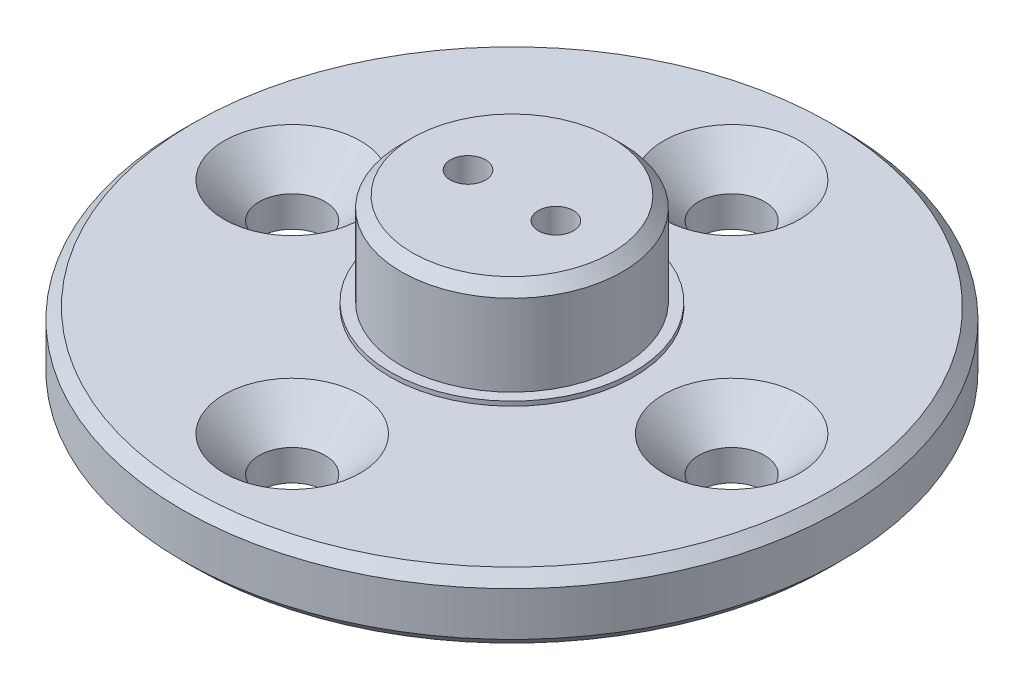
ISO-10303-21;
HEADER;
FILE_DESCRIPTION(('STEP AP214'),'2;1');
FILE_NAME('part.step','',(''),(''),'','','');
FILE_SCHEMA(('AUTOMOTIVE_DESIGN { 1 0 10303 214 1 1 1 1 }'));
ENDSEC;
DATA;
#1=APPLICATION_CONTEXT('core data for automotive mechanical design processes');
#2=APPLICATION_PROTOCOL_DEFINITION('international standard','automotive_design',2000,#1);
#3=PRODUCT_CONTEXT('',#1,'mechanical');
#4=PRODUCT('Part','Part','',(#3));
#5=PRODUCT_RELATED_PRODUCT_CATEGORY('part','',(#4));
#6=PRODUCT_DEFINITION_FORMATION('','',#4);
#7=PRODUCT_DEFINITION_CONTEXT('part definition',#1,'design');
#8=PRODUCT_DEFINITION('design','',#6,#7);
#9=PRODUCT_DEFINITION_SHAPE('','',#8);
#10=(LENGTH_UNIT() NAMED_UNIT(*) SI_UNIT(.MILLI.,.METRE.));
#11=(NAMED_UNIT(*) PLANE_ANGLE_UNIT() SI_UNIT($,.RADIAN.));
#12=(NAMED_UNIT(*) SI_UNIT($,.STERADIAN.) SOLID_ANGLE_UNIT());
#13=UNCERTAINTY_MEASURE_WITH_UNIT(LENGTH_MEASURE(1.E-05),#10,'distance_accuracy_value','');
#14=(GEOMETRIC_REPRESENTATION_CONTEXT(3) GLOBAL_UNCERTAINTY_ASSIGNED_CONTEXT((#13)) GLOBAL_UNIT_ASSIGNED_CONTEXT((#10,
#11,#12)) REPRESENTATION_CONTEXT('',''));
#15=CARTESIAN_POINT('',(0.,0.,0.));
#16=DIRECTION('',(0.,0.,1.));
#17=DIRECTION('',(1.,0.,0.));
#18=AXIS2_PLACEMENT_3D('',#15,#16,#17);
#19=CARTESIAN_POINT('',(0.,3.,0.));
#20=DIRECTION('',(0.,1.,0.));
#21=DIRECTION('',(0.,0.,1.));
#22=AXIS2_PLACEMENT_3D('',#19,#20,#21);
#23=PLANE('',#22);
#24=CARTESIAN_POINT('',(9.99999999999972,3.,0.));
#25=DIRECTION('',(0.,1.,0.));
#26=DIRECTION('',(0.,0.,1.));
#27=AXIS2_PLACEMENT_3D('',#24,#25,#26);
#28=CIRCLE('',#27,3.1);
#29=CARTESIAN_POINT('',(9.99999999999972,3.,3.10000000000004));
#30=VERTEX_POINT('',#29);
#31=EDGE_CURVE('E51',#30,#30,#28,.F.);
#32=ORIENTED_EDGE('',*,*,#31,.T.);
#33=EDGE_LOOP('',(#32));
#34=FACE_BOUND('',#33,.T.);
#35=CARTESIAN_POINT('',(2.8275992658422E-13,3.,10.));
#36=DIRECTION('',(0.,1.,0.));
#37=DIRECTION('',(0.,0.,1.));
#38=AXIS2_PLACEMENT_3D('',#35,#36,#37);
#39=CIRCLE('',#38,3.10000000000062);
#40=CARTESIAN_POINT('',(2.8275992658422E-13,3.,13.1000000000006));
#41=VERTEX_POINT('',#40);
#42=EDGE_CURVE('E56',#41,#41,#39,.F.);
#43=ORIENTED_EDGE('',*,*,#42,.T.);
#44=EDGE_LOOP('',(#43));
#45=FACE_BOUND('',#44,.T.);
#46=CARTESIAN_POINT('',(-10.0000000000003,3.,-1.04083408558608E-13));
#47=DIRECTION('',(0.,1.,0.));
#48=DIRECTION('',(0.,0.,1.));
#49=AXIS2_PLACEMENT_3D('',#46,#47,#48);
#50=CIRCLE('',#49,3.1);
#51=CARTESIAN_POINT('',(-10.0000000000003,3.,3.0999999999999));
#52=VERTEX_POINT('',#51);
#53=EDGE_CURVE('E59',#52,#52,#50,.F.);
#54=ORIENTED_EDGE('',*,*,#53,.T.);
#55=EDGE_LOOP('',(#54));
#56=FACE_BOUND('',#55,.T.);
#57=CARTESIAN_POINT('',(-2.81025203108243E-13,3.,-10.));
#58=DIRECTION('',(0.,1.,0.));
#59=DIRECTION('',(0.,0.,1.));
#60=AXIS2_PLACEMENT_3D('',#57,#58,#59);
#61=CIRCLE('',#60,3.1);
#62=CARTESIAN_POINT('',(-2.81025203108243E-13,3.,-6.90000000000001));
#63=VERTEX_POINT('',#62);
#64=EDGE_CURVE('E62',#63,#63,#61,.F.);
#65=ORIENTED_EDGE('',*,*,#64,.T.);
#66=EDGE_LOOP('',(#65));
#67=FACE_BOUND('',#66,.T.);
#68=CARTESIAN_POINT('',(0.,3.,0.));
#69=DIRECTION('',(0.,1.,0.));
#70=DIRECTION('',(0.,0.,1.));
#71=AXIS2_PLACEMENT_3D('',#68,#69,#70);
#72=CIRCLE('',#71,14.5);
#73=CARTESIAN_POINT('',(0.,3.,14.5));
#74=VERTEX_POINT('',#73);
#75=EDGE_CURVE('E68',#74,#74,#72,.T.);
#76=ORIENTED_EDGE('',*,*,#75,.T.);
#77=EDGE_LOOP('',(#76));
#78=FACE_BOUND('',#77,.T.);
#79=CARTESIAN_POINT('',(0.,3.,0.));
#80=DIRECTION('',(0.,1.,0.));
#81=DIRECTION('',(0.,0.,1.));
#82=AXIS2_PLACEMENT_3D('',#79,#80,#81);
#83=CIRCLE('',#82,5.535);
#84=CARTESIAN_POINT('',(0.,3.,5.535));
#85=VERTEX_POINT('',#84);
#86=EDGE_CURVE('E108',#85,#85,#83,.T.);
#87=ORIENTED_EDGE('',*,*,#86,.F.);
#88=EDGE_LOOP('',(#87));
#89=FACE_BOUND('',#88,.T.);
#90=ADVANCED_FACE('F35',(#34,#45,#56,#67,#78,#89),#23,.T.);
#91=CARTESIAN_POINT('',(0.,0.,0.));
#92=DIRECTION('',(0.,1.,0.));
#93=DIRECTION('',(0.,0.,1.));
#94=AXIS2_PLACEMENT_3D('',#91,#92,#93);
#95=PLANE('',#94);
#96=CARTESIAN_POINT('',(2.,0.,0.));
#97=DIRECTION('',(0.,1.,0.));
#98=DIRECTION('',(0.,0.,1.));
#99=AXIS2_PLACEMENT_3D('',#96,#97,#98);
#100=CIRCLE('',#99,0.8);
#101=CARTESIAN_POINT('',(2.,0.,0.8));
#102=VERTEX_POINT('',#101);
#103=EDGE_CURVE('E111',#102,#102,#100,.T.);
#104=ORIENTED_EDGE('',*,*,#103,.T.);
#105=EDGE_LOOP('',(#104));
#106=FACE_BOUND('',#105,.T.);
#107=CARTESIAN_POINT('',(-2.,0.,0.));
#108=DIRECTION('',(0.,1.,0.));
#109=DIRECTION('',(0.,0.,1.));
#110=AXIS2_PLACEMENT_3D('',#107,#108,#109);
#111=CIRCLE('',#110,0.8);
#112=CARTESIAN_POINT('',(-2.,0.,0.800000000000001));
#113=VERTEX_POINT('',#112);
#114=EDGE_CURVE('E116',#113,#113,#111,.T.);
#115=ORIENTED_EDGE('',*,*,#114,.T.);
#116=EDGE_LOOP('',(#115));
#117=FACE_BOUND('',#116,.T.);
#118=CARTESIAN_POINT('',(0.,0.,0.));
#119=DIRECTION('',(0.,1.,0.));
#120=DIRECTION('',(0.,0.,1.));
#121=AXIS2_PLACEMENT_3D('',#118,#119,#120);
#122=CIRCLE('',#121,14.5);
#123=CARTESIAN_POINT('',(0.,0.,14.5));
#124=VERTEX_POINT('',#123);
#125=EDGE_CURVE('E71',#124,#124,#122,.F.);
#126=ORIENTED_EDGE('',*,*,#125,.T.);
#127=EDGE_LOOP('',(#126));
#128=FACE_BOUND('',#127,.T.);
#129=CARTESIAN_POINT('',(-2.81025203108243E-13,0.,-10.));
#130=DIRECTION('',(0.,1.,0.));
#131=DIRECTION('',(0.,0.,1.));
#132=AXIS2_PLACEMENT_3D('',#129,#130,#131);
#133=CIRCLE('',#132,1.5);
#134=CARTESIAN_POINT('',(-2.81025203108243E-13,0.,-8.50000000000002));
#135=VERTEX_POINT('',#134);
#136=EDGE_CURVE('E86',#135,#135,#133,.T.);
#137=ORIENTED_EDGE('',*,*,#136,.T.);
#138=EDGE_LOOP('',(#137));
#139=FACE_BOUND('',#138,.T.);
#140=CARTESIAN_POINT('',(9.99999999999972,0.,0.));
#141=DIRECTION('',(0.,1.,0.));
#142=DIRECTION('',(0.,0.,1.));
#143=AXIS2_PLACEMENT_3D('',#140,#141,#142);
#144=CIRCLE('',#143,1.5);
#145=CARTESIAN_POINT('',(9.99999999999972,0.,1.50000000000004));
#146=VERTEX_POINT('',#145);
#147=EDGE_CURVE('E89',#146,#146,#144,.T.);
#148=ORIENTED_EDGE('',*,*,#147,.T.);
#149=EDGE_LOOP('',(#148));
#150=FACE_BOUND('',#149,.T.);
#151=CARTESIAN_POINT('',(2.8275992658422E-13,0.,10.));
#152=DIRECTION('',(0.,1.,0.));
#153=DIRECTION('',(0.,0.,1.));
#154=AXIS2_PLACEMENT_3D('',#151,#152,#153);
#155=CIRCLE('',#154,1.50000000000061);
#156=CARTESIAN_POINT('',(2.8275992658422E-13,0.,11.5000000000006));
#157=VERTEX_POINT('',#156);
#158=EDGE_CURVE('E92',#157,#157,#155,.T.);
#159=ORIENTED_EDGE('',*,*,#158,.T.);
#160=EDGE_LOOP('',(#159));
#161=FACE_BOUND('',#160,.T.);
#162=CARTESIAN_POINT('',(-10.0000000000003,0.,-1.04083408558608E-13));
#163=DIRECTION('',(0.,1.,0.));
#164=DIRECTION('',(0.,0.,1.));
#165=AXIS2_PLACEMENT_3D('',#162,#163,#164);
#166=CIRCLE('',#165,1.5);
#167=CARTESIAN_POINT('',(-10.0000000000003,0.,1.49999999999989));
#168=VERTEX_POINT('',#167);
#169=EDGE_CURVE('E95',#168,#168,#166,.T.);
#170=ORIENTED_EDGE('',*,*,#169,.T.);
#171=EDGE_LOOP('',(#170));
#172=FACE_BOUND('',#171,.T.);
#173=ADVANCED_FACE('F120',(#106,#117,#128,#139,#150,#161,#172),#95,.F.);
#174=CARTESIAN_POINT('',(0.,3.,0.));
#175=DIRECTION('',(0.,-1.,0.));
#176=DIRECTION('',(0.,0.,-1.));
#177=AXIS2_PLACEMENT_3D('',#174,#175,#176);
#178=CYLINDRICAL_SURFACE('',#177,15.);
#179=CARTESIAN_POINT('',(0.,0.499999999999999,0.));
#180=DIRECTION('',(0.,1.,0.));
#181=DIRECTION('',(0.,0.,1.));
#182=AXIS2_PLACEMENT_3D('',#179,#180,#181);
#183=CIRCLE('',#182,15.);
#184=CARTESIAN_POINT('',(0.,0.499999999999999,15.));
#185=VERTEX_POINT('',#184);
#186=EDGE_CURVE('E74',#185,#185,#183,.T.);
#187=ORIENTED_EDGE('',*,*,#186,.T.);
#188=EDGE_LOOP('',(#187));
#189=FACE_BOUND('',#188,.T.);
#190=CARTESIAN_POINT('',(0.,2.5,0.));
#191=DIRECTION('',(0.,1.,0.));
#192=DIRECTION('',(0.,0.,1.));
#193=AXIS2_PLACEMENT_3D('',#190,#191,#192);
#194=CIRCLE('',#193,15.);
#195=CARTESIAN_POINT('',(0.,2.5,15.));
#196=VERTEX_POINT('',#195);
#197=EDGE_CURVE('E77',#196,#196,#194,.F.);
#198=ORIENTED_EDGE('',*,*,#197,.T.);
#199=EDGE_LOOP('',(#198));
#200=FACE_BOUND('',#199,.T.);
#201=ADVANCED_FACE('F147',(#189,#200),#178,.T.);
#202=CARTESIAN_POINT('',(-2.81025203108243E-13,3.,-10.));
#203=DIRECTION('',(0.,-1.,0.));
#204=DIRECTION('',(0.,0.,-1.));
#205=AXIS2_PLACEMENT_3D('',#202,#203,#204);
#206=CYLINDRICAL_SURFACE('',#205,1.5);
#207=CARTESIAN_POINT('',(-2.81025203108243E-13,1.40000000000001,-10.));
#208=DIRECTION('',(0.,1.,0.));
#209=DIRECTION('',(0.,0.,1.));
#210=AXIS2_PLACEMENT_3D('',#207,#208,#209);
#211=CIRCLE('',#210,1.5);
#212=CARTESIAN_POINT('',(-2.81025203108243E-13,1.40000000000001,-8.50000000000002));
#213=VERTEX_POINT('',#212);
#214=EDGE_CURVE('E10',#213,#213,#211,.T.);
#215=ORIENTED_EDGE('',*,*,#214,.T.);
#216=EDGE_LOOP('',(#215));
#217=FACE_BOUND('',#216,.T.);
#218=ORIENTED_EDGE('',*,*,#136,.F.);
#219=EDGE_LOOP('',(#218));
#220=FACE_BOUND('',#219,.T.);
#221=ADVANCED_FACE('F152',(#217,#220),#206,.F.);
#222=CARTESIAN_POINT('',(9.99999999999972,3.,0.));
#223=DIRECTION('',(0.,-1.,0.));
#224=DIRECTION('',(0.,0.,-1.));
#225=AXIS2_PLACEMENT_3D('',#222,#223,#224);
#226=CYLINDRICAL_SURFACE('',#225,1.5);
#227=CARTESIAN_POINT('',(9.99999999999972,1.40000000000001,0.));
#228=DIRECTION('',(0.,1.,0.));
#229=DIRECTION('',(0.,0.,1.));
#230=AXIS2_PLACEMENT_3D('',#227,#228,#229);
#231=CIRCLE('',#230,1.5);
#232=CARTESIAN_POINT('',(9.99999999999972,1.40000000000001,1.50000000000004));
#233=VERTEX_POINT('',#232);
#234=EDGE_CURVE('E65',#233,#233,#231,.T.);
#235=ORIENTED_EDGE('',*,*,#234,.T.);
#236=EDGE_LOOP('',(#235));
#237=FACE_BOUND('',#236,.T.);
#238=ORIENTED_EDGE('',*,*,#147,.F.);
#239=EDGE_LOOP('',(#238));
#240=FACE_BOUND('',#239,.T.);
#241=ADVANCED_FACE('F226',(#237,#240),#226,.F.);
#242=CARTESIAN_POINT('',(2.8275992658422E-13,3.,10.));
#243=DIRECTION('',(0.,-1.,0.));
#244=DIRECTION('',(0.,0.,-1.));
#245=AXIS2_PLACEMENT_3D('',#242,#243,#244);
#246=CYLINDRICAL_SURFACE('',#245,1.50000000000061);
#247=CARTESIAN_POINT('',(2.8275992658422E-13,1.4,10.));
#248=DIRECTION('',(0.,1.,0.));
#249=DIRECTION('',(0.,0.,1.));
#250=AXIS2_PLACEMENT_3D('',#247,#248,#249);
#251=CIRCLE('',#250,1.50000000000061);
#252=CARTESIAN_POINT('',(2.8275992658422E-13,1.4,11.5000000000006));
#253=VERTEX_POINT('',#252);
#254=EDGE_CURVE('E47',#253,#253,#251,.T.);
#255=ORIENTED_EDGE('',*,*,#254,.T.);
#256=EDGE_LOOP('',(#255));
#257=FACE_BOUND('',#256,.T.);
#258=ORIENTED_EDGE('',*,*,#158,.F.);
#259=EDGE_LOOP('',(#258));
#260=FACE_BOUND('',#259,.T.);
#261=ADVANCED_FACE('F219',(#257,#260),#246,.F.);
#262=CARTESIAN_POINT('',(-10.0000000000003,3.,-1.04083408558608E-13));
#263=DIRECTION('',(0.,-1.,0.));
#264=DIRECTION('',(0.,0.,-1.));
#265=AXIS2_PLACEMENT_3D('',#262,#263,#264);
#266=CYLINDRICAL_SURFACE('',#265,1.5);
#267=CARTESIAN_POINT('',(-10.0000000000003,1.4,-1.04083408558608E-13));
#268=DIRECTION('',(0.,1.,0.));
#269=DIRECTION('',(0.,0.,1.));
#270=AXIS2_PLACEMENT_3D('',#267,#268,#269);
#271=CIRCLE('',#270,1.5);
#272=CARTESIAN_POINT('',(-10.0000000000003,1.4,1.49999999999989));
#273=VERTEX_POINT('',#272);
#274=EDGE_CURVE('E43',#273,#273,#271,.T.);
#275=ORIENTED_EDGE('',*,*,#274,.T.);
#276=EDGE_LOOP('',(#275));
#277=FACE_BOUND('',#276,.T.);
#278=ORIENTED_EDGE('',*,*,#169,.F.);
#279=EDGE_LOOP('',(#278));
#280=FACE_BOUND('',#279,.T.);
#281=ADVANCED_FACE('F210',(#277,#280),#266,.F.);
#282=CARTESIAN_POINT('',(0.,3.2,0.));
#283=DIRECTION('',(0.,-1.,0.));
#284=DIRECTION('',(0.,0.,-1.));
#285=AXIS2_PLACEMENT_3D('',#282,#283,#284);
#286=CYLINDRICAL_SURFACE('',#285,5.535);
#287=CARTESIAN_POINT('',(0.,3.2,0.));
#288=DIRECTION('',(0.,1.,0.));
#289=DIRECTION('',(0.,0.,1.));
#290=AXIS2_PLACEMENT_3D('',#287,#288,#289);
#291=CIRCLE('',#290,5.535);
#292=CARTESIAN_POINT('',(0.,3.2,5.535));
#293=VERTEX_POINT('',#292);
#294=EDGE_CURVE('E107',#293,#293,#291,.T.);
#295=ORIENTED_EDGE('',*,*,#294,.F.);
#296=EDGE_LOOP('',(#295));
#297=FACE_BOUND('',#296,.T.);
#298=ORIENTED_EDGE('',*,*,#86,.T.);
#299=EDGE_LOOP('',(#298));
#300=FACE_BOUND('',#299,.T.);
#301=ADVANCED_FACE('F207',(#297,#300),#286,.T.);
#302=CARTESIAN_POINT('',(0.,3.2,0.));
#303=DIRECTION('',(0.,1.,0.));
#304=DIRECTION('',(0.,0.,1.));
#305=AXIS2_PLACEMENT_3D('',#302,#303,#304);
#306=PLANE('',#305);
#307=CARTESIAN_POINT('',(0.,3.2,0.));
#308=DIRECTION('',(0.,1.,0.));
#309=DIRECTION('',(0.,0.,1.));
#310=AXIS2_PLACEMENT_3D('',#307,#308,#309);
#311=CIRCLE('',#310,5.035);
#312=CARTESIAN_POINT('',(0.,3.2,5.035));
#313=VERTEX_POINT('',#312);
#314=EDGE_CURVE('E104',#313,#313,#311,.T.);
#315=ORIENTED_EDGE('',*,*,#314,.F.);
#316=EDGE_LOOP('',(#315));
#317=FACE_BOUND('',#316,.T.);
#318=ORIENTED_EDGE('',*,*,#294,.T.);
#319=EDGE_LOOP('',(#318));
#320=FACE_BOUND('',#319,.T.);
#321=ADVANCED_FACE('F209',(#317,#320),#306,.T.);
#322=CARTESIAN_POINT('',(0.,7.4,0.));
#323=DIRECTION('',(0.,-1.,0.));
#324=DIRECTION('',(0.,0.,-1.));
#325=AXIS2_PLACEMENT_3D('',#322,#323,#324);
#326=CYLINDRICAL_SURFACE('',#325,5.035);
#327=CARTESIAN_POINT('',(0.,6.89999999999999,0.));
#328=DIRECTION('',(0.,1.,0.));
#329=DIRECTION('',(0.,0.,1.));
#330=AXIS2_PLACEMENT_3D('',#327,#328,#329);
#331=CIRCLE('',#330,5.035);
#332=CARTESIAN_POINT('',(0.,6.89999999999999,5.035));
#333=VERTEX_POINT('',#332);
#334=EDGE_CURVE('E80',#333,#333,#331,.F.);
#335=ORIENTED_EDGE('',*,*,#334,.T.);
#336=EDGE_LOOP('',(#335));
#337=FACE_BOUND('',#336,.T.);
#338=ORIENTED_EDGE('',*,*,#314,.T.);
#339=EDGE_LOOP('',(#338));
#340=FACE_BOUND('',#339,.T.);
#341=ADVANCED_FACE('F216',(#337,#340),#326,.T.);
#342=CARTESIAN_POINT('',(2.,7.4,0.));
#343=DIRECTION('',(0.,-1.,0.));
#344=DIRECTION('',(0.,0.,-1.));
#345=AXIS2_PLACEMENT_3D('',#342,#343,#344);
#346=CYLINDRICAL_SURFACE('',#345,0.8);
#347=CARTESIAN_POINT('',(2.,7.4,0.));
#348=DIRECTION('',(0.,1.,0.));
#349=DIRECTION('',(0.,0.,1.));
#350=AXIS2_PLACEMENT_3D('',#347,#348,#349);
#351=CIRCLE('',#350,0.8);
#352=CARTESIAN_POINT('',(2.,7.4,0.8));
#353=VERTEX_POINT('',#352);
#354=EDGE_CURVE('E98',#353,#353,#351,.T.);
#355=ORIENTED_EDGE('',*,*,#354,.T.);
#356=EDGE_LOOP('',(#355));
#357=FACE_BOUND('',#356,.T.);
#358=ORIENTED_EDGE('',*,*,#103,.F.);
#359=EDGE_LOOP('',(#358));
#360=FACE_BOUND('',#359,.T.);
#361=ADVANCED_FACE('F136',(#357,#360),#346,.F.);
#362=CARTESIAN_POINT('',(0.,7.4,0.));
#363=DIRECTION('',(0.,1.,0.));
#364=DIRECTION('',(0.,0.,1.));
#365=AXIS2_PLACEMENT_3D('',#362,#363,#364);
#366=PLANE('',#365);
#367=CARTESIAN_POINT('',(0.,7.4,0.));
#368=DIRECTION('',(0.,1.,0.));
#369=DIRECTION('',(0.,0.,1.));
#370=AXIS2_PLACEMENT_3D('',#367,#368,#369);
#371=CIRCLE('',#370,4.535);
#372=CARTESIAN_POINT('',(0.,7.4,4.535));
#373=VERTEX_POINT('',#372);
#374=EDGE_CURVE('E83',#373,#373,#371,.T.);
#375=ORIENTED_EDGE('',*,*,#374,.T.);
#376=EDGE_LOOP('',(#375));
#377=FACE_BOUND('',#376,.T.);
#378=ORIENTED_EDGE('',*,*,#354,.F.);
#379=EDGE_LOOP('',(#378));
#380=FACE_BOUND('',#379,.T.);
#381=CARTESIAN_POINT('',(-2.,7.4,0.));
#382=DIRECTION('',(0.,1.,0.));
#383=DIRECTION('',(0.,0.,-1.));
#384=AXIS2_PLACEMENT_3D('',#381,#382,#383);
#385=CIRCLE('',#384,0.8);
#386=CARTESIAN_POINT('',(-2.,7.4,-0.799999999999999));
#387=VERTEX_POINT('',#386);
#388=EDGE_CURVE('E101',#387,#387,#385,.T.);
#389=ORIENTED_EDGE('',*,*,#388,.F.);
#390=EDGE_LOOP('',(#389));
#391=FACE_BOUND('',#390,.T.);
#392=ADVANCED_FACE('F126',(#377,#380,#391),#366,.T.);
#393=CARTESIAN_POINT('',(-2.,7.4,0.));
#394=DIRECTION('',(0.,-1.,0.));
#395=DIRECTION('',(0.,0.,-1.));
#396=AXIS2_PLACEMENT_3D('',#393,#394,#395);
#397=CYLINDRICAL_SURFACE('',#396,0.8);
#398=ORIENTED_EDGE('',*,*,#388,.T.);
#399=EDGE_LOOP('',(#398));
#400=FACE_BOUND('',#399,.T.);
#401=ORIENTED_EDGE('',*,*,#114,.F.);
#402=EDGE_LOOP('',(#401));
#403=FACE_BOUND('',#402,.T.);
#404=ADVANCED_FACE('F123',(#400,#403),#397,.F.);
#405=CARTESIAN_POINT('',(0.,7.4,0.));
#406=DIRECTION('',(0.,-1.,0.));
#407=DIRECTION('',(0.,0.,-1.));
#408=AXIS2_PLACEMENT_3D('',#405,#406,#407);
#409=CONICAL_SURFACE('',#408,4.535,0.785398163397441);
#410=ORIENTED_EDGE('',*,*,#334,.F.);
#411=EDGE_LOOP('',(#410));
#412=FACE_BOUND('',#411,.T.);
#413=ORIENTED_EDGE('',*,*,#374,.F.);
#414=EDGE_LOOP('',(#413));
#415=FACE_BOUND('',#414,.T.);
#416=ADVANCED_FACE('F125',(#412,#415),#409,.T.);
#417=CARTESIAN_POINT('',(0.,0.499999999999999,0.));
#418=DIRECTION('',(0.,1.,0.));
#419=DIRECTION('',(0.,0.,1.));
#420=AXIS2_PLACEMENT_3D('',#417,#418,#419);
#421=CONICAL_SURFACE('',#420,15.,0.785398163397452);
#422=ORIENTED_EDGE('',*,*,#125,.F.);
#423=EDGE_LOOP('',(#422));
#424=FACE_BOUND('',#423,.T.);
#425=ORIENTED_EDGE('',*,*,#186,.F.);
#426=EDGE_LOOP('',(#425));
#427=FACE_BOUND('',#426,.T.);
#428=ADVANCED_FACE('F133',(#424,#427),#421,.T.);
#429=CARTESIAN_POINT('',(0.,3.,0.));
#430=DIRECTION('',(0.,-1.,0.));
#431=DIRECTION('',(0.,0.,-1.));
#432=AXIS2_PLACEMENT_3D('',#429,#430,#431);
#433=CONICAL_SURFACE('',#432,14.5,0.78539816339745);
#434=ORIENTED_EDGE('',*,*,#197,.F.);
#435=EDGE_LOOP('',(#434));
#436=FACE_BOUND('',#435,.T.);
#437=ORIENTED_EDGE('',*,*,#75,.F.);
#438=EDGE_LOOP('',(#437));
#439=FACE_BOUND('',#438,.T.);
#440=ADVANCED_FACE('F167',(#436,#439),#433,.T.);
#441=CARTESIAN_POINT('',(9.99999999999972,1.40000000000001,0.));
#442=DIRECTION('',(0.,1.,0.));
#443=DIRECTION('',(0.,0.,1.));
#444=AXIS2_PLACEMENT_3D('',#441,#442,#443);
#445=CONICAL_SURFACE('',#444,1.5,0.785398163397451);
#446=ORIENTED_EDGE('',*,*,#31,.F.);
#447=EDGE_LOOP('',(#446));
#448=FACE_BOUND('',#447,.T.);
#449=ORIENTED_EDGE('',*,*,#234,.F.);
#450=EDGE_LOOP('',(#449));
#451=FACE_BOUND('',#450,.T.);
#452=ADVANCED_FACE('F174',(#448,#451),#445,.F.);
#453=CARTESIAN_POINT('',(2.8275992658422E-13,1.4,10.));
#454=DIRECTION('',(0.,1.,0.));
#455=DIRECTION('',(0.,0.,1.));
#456=AXIS2_PLACEMENT_3D('',#453,#454,#455);
#457=CONICAL_SURFACE('',#456,1.50000000000061,0.785398163397451);
#458=ORIENTED_EDGE('',*,*,#42,.F.);
#459=EDGE_LOOP('',(#458));
#460=FACE_BOUND('',#459,.T.);
#461=ORIENTED_EDGE('',*,*,#254,.F.);
#462=EDGE_LOOP('',(#461));
#463=FACE_BOUND('',#462,.T.);
#464=ADVANCED_FACE('F181',(#460,#463),#457,.F.);
#465=CARTESIAN_POINT('',(-10.0000000000003,1.4,-1.04083408558608E-13));
#466=DIRECTION('',(0.,1.,0.));
#467=DIRECTION('',(0.,0.,1.));
#468=AXIS2_PLACEMENT_3D('',#465,#466,#467);
#469=CONICAL_SURFACE('',#468,1.5,0.785398163397451);
#470=ORIENTED_EDGE('',*,*,#53,.F.);
#471=EDGE_LOOP('',(#470));
#472=FACE_BOUND('',#471,.T.);
#473=ORIENTED_EDGE('',*,*,#274,.F.);
#474=EDGE_LOOP('',(#473));
#475=FACE_BOUND('',#474,.T.);
#476=ADVANCED_FACE('F187',(#472,#475),#469,.F.);
#477=CARTESIAN_POINT('',(-2.81025203108243E-13,1.40000000000001,-10.));
#478=DIRECTION('',(0.,1.,0.));
#479=DIRECTION('',(0.,0.,1.));
#480=AXIS2_PLACEMENT_3D('',#477,#478,#479);
#481=CONICAL_SURFACE('',#480,1.5,0.785398163397451);
#482=ORIENTED_EDGE('',*,*,#64,.F.);
#483=EDGE_LOOP('',(#482));
#484=FACE_BOUND('',#483,.T.);
#485=ORIENTED_EDGE('',*,*,#214,.F.);
#486=EDGE_LOOP('',(#485));
#487=FACE_BOUND('',#486,.T.);
#488=ADVANCED_FACE('F38',(#484,#487),#481,.F.);
#489=CLOSED_SHELL('',(#90,#173,#201,#221,#241,#261,#281,#301,#321,#341,#361,#392,#404,#416,#428,
#440,#452,#464,#476,#488));
#490=MANIFOLD_SOLID_BREP('B2',#489);
#491=ADVANCED_BREP_SHAPE_REPRESENTATION('',(#18,#490),#14);
#492=SHAPE_DEFINITION_REPRESENTATION(#9,#491);
ENDSEC;
END-ISO-10303-21;
